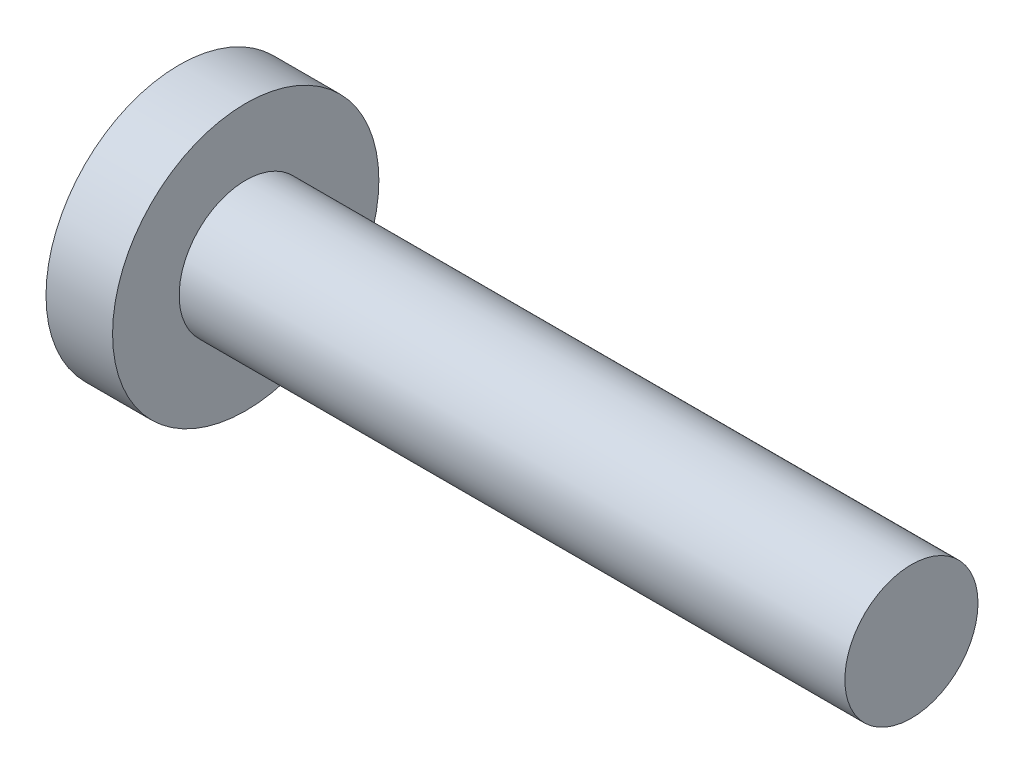
ISO-10303-21;
HEADER;
FILE_DESCRIPTION(('STEP AP214'),'2;1');
FILE_NAME('part.step','',(''),(''),'','','');
FILE_SCHEMA(('AUTOMOTIVE_DESIGN { 1 0 10303 214 1 1 1 1 }'));
ENDSEC;
DATA;
#1=APPLICATION_CONTEXT('core data for automotive mechanical design processes');
#2=APPLICATION_PROTOCOL_DEFINITION('international standard','automotive_design',2000,#1);
#3=PRODUCT_CONTEXT('',#1,'mechanical');
#4=PRODUCT('Part','Part','',(#3));
#5=PRODUCT_RELATED_PRODUCT_CATEGORY('part','',(#4));
#6=PRODUCT_DEFINITION_FORMATION('','',#4);
#7=PRODUCT_DEFINITION_CONTEXT('part definition',#1,'design');
#8=PRODUCT_DEFINITION('design','',#6,#7);
#9=PRODUCT_DEFINITION_SHAPE('','',#8);
#10=(LENGTH_UNIT() NAMED_UNIT(*) SI_UNIT(.MILLI.,.METRE.));
#11=(NAMED_UNIT(*) PLANE_ANGLE_UNIT() SI_UNIT($,.RADIAN.));
#12=(NAMED_UNIT(*) SI_UNIT($,.STERADIAN.) SOLID_ANGLE_UNIT());
#13=UNCERTAINTY_MEASURE_WITH_UNIT(LENGTH_MEASURE(1.E-05),#10,'distance_accuracy_value','');
#14=(GEOMETRIC_REPRESENTATION_CONTEXT(3) GLOBAL_UNCERTAINTY_ASSIGNED_CONTEXT((#13)) GLOBAL_UNIT_ASSIGNED_CONTEXT((#10,
#11,#12)) REPRESENTATION_CONTEXT('',''));
#15=CARTESIAN_POINT('',(0.,0.,0.));
#16=DIRECTION('',(0.,0.,1.));
#17=DIRECTION('',(1.,0.,0.));
#18=AXIS2_PLACEMENT_3D('',#15,#16,#17);
#19=CARTESIAN_POINT('',(25.4,0.,0.));
#20=DIRECTION('',(-1.,0.,0.));
#21=DIRECTION('',(0.,0.,1.));
#22=AXIS2_PLACEMENT_3D('',#19,#20,#21);
#23=CYLINDRICAL_SURFACE('',#22,2.54);
#24=CARTESIAN_POINT('',(25.4,0.,0.));
#25=DIRECTION('',(1.,0.,0.));
#26=DIRECTION('',(0.,0.,-1.));
#27=AXIS2_PLACEMENT_3D('',#24,#25,#26);
#28=CIRCLE('',#27,2.54);
#29=CARTESIAN_POINT('',(25.4,0.,-2.54));
#30=VERTEX_POINT('',#29);
#31=EDGE_CURVE('E10',#30,#30,#28,.T.);
#32=ORIENTED_EDGE('',*,*,#31,.F.);
#33=EDGE_LOOP('',(#32));
#34=FACE_BOUND('',#33,.T.);
#35=CARTESIAN_POINT('',(0.,0.,0.));
#36=DIRECTION('',(1.,0.,0.));
#37=DIRECTION('',(0.,0.,-1.));
#38=AXIS2_PLACEMENT_3D('',#35,#36,#37);
#39=CIRCLE('',#38,2.54);
#40=CARTESIAN_POINT('',(0.,0.,-2.54));
#41=VERTEX_POINT('',#40);
#42=EDGE_CURVE('E40',#41,#41,#39,.T.);
#43=ORIENTED_EDGE('',*,*,#42,.T.);
#44=EDGE_LOOP('',(#43));
#45=FACE_BOUND('',#44,.T.);
#46=ADVANCED_FACE('F37',(#34,#45),#23,.T.);
#47=CARTESIAN_POINT('',(25.4,0.,0.));
#48=DIRECTION('',(1.,0.,0.));
#49=DIRECTION('',(0.,0.,-1.));
#50=AXIS2_PLACEMENT_3D('',#47,#48,#49);
#51=PLANE('',#50);
#52=ORIENTED_EDGE('',*,*,#31,.T.);
#53=EDGE_LOOP('',(#52));
#54=FACE_BOUND('',#53,.T.);
#55=ADVANCED_FACE('F64',(#54),#51,.T.);
#56=CARTESIAN_POINT('',(-2.54,0.,0.));
#57=DIRECTION('',(1.,0.,0.));
#58=DIRECTION('',(0.,0.,-1.));
#59=AXIS2_PLACEMENT_3D('',#56,#57,#58);
#60=CYLINDRICAL_SURFACE('',#59,5.08);
#61=CARTESIAN_POINT('',(-2.54,0.,0.));
#62=DIRECTION('',(-1.,0.,0.));
#63=DIRECTION('',(0.,0.,1.));
#64=AXIS2_PLACEMENT_3D('',#61,#62,#63);
#65=CIRCLE('',#64,5.08);
#66=CARTESIAN_POINT('',(-2.54,0.,5.08));
#67=VERTEX_POINT('',#66);
#68=EDGE_CURVE('E49',#67,#67,#65,.T.);
#69=ORIENTED_EDGE('',*,*,#68,.F.);
#70=EDGE_LOOP('',(#69));
#71=FACE_BOUND('',#70,.T.);
#72=CARTESIAN_POINT('',(0.,0.,0.));
#73=DIRECTION('',(-1.,0.,0.));
#74=DIRECTION('',(0.,0.,1.));
#75=AXIS2_PLACEMENT_3D('',#72,#73,#74);
#76=CIRCLE('',#75,5.08);
#77=CARTESIAN_POINT('',(0.,0.,5.08));
#78=VERTEX_POINT('',#77);
#79=EDGE_CURVE('E51',#78,#78,#76,.T.);
#80=ORIENTED_EDGE('',*,*,#79,.T.);
#81=EDGE_LOOP('',(#80));
#82=FACE_BOUND('',#81,.T.);
#83=ADVANCED_FACE('F61',(#71,#82),#60,.T.);
#84=CARTESIAN_POINT('',(-2.54,0.,0.));
#85=DIRECTION('',(-1.,0.,0.));
#86=DIRECTION('',(0.,0.,1.));
#87=AXIS2_PLACEMENT_3D('',#84,#85,#86);
#88=PLANE('',#87);
#89=ORIENTED_EDGE('',*,*,#68,.T.);
#90=EDGE_LOOP('',(#89));
#91=FACE_BOUND('',#90,.T.);
#92=ADVANCED_FACE('F59',(#91),#88,.T.);
#93=CARTESIAN_POINT('',(0.,0.,0.));
#94=DIRECTION('',(-1.,0.,0.));
#95=DIRECTION('',(0.,0.,1.));
#96=AXIS2_PLACEMENT_3D('',#93,#94,#95);
#97=PLANE('',#96);
#98=ORIENTED_EDGE('',*,*,#42,.F.);
#99=EDGE_LOOP('',(#98));
#100=FACE_BOUND('',#99,.T.);
#101=ORIENTED_EDGE('',*,*,#79,.F.);
#102=EDGE_LOOP('',(#101));
#103=FACE_BOUND('',#102,.T.);
#104=ADVANCED_FACE('F68',(#100,#103),#97,.F.);
#105=CLOSED_SHELL('',(#46,#55,#83,#92,#104));
#106=MANIFOLD_SOLID_BREP('B2',#105);
#107=ADVANCED_BREP_SHAPE_REPRESENTATION('',(#18,#106),#14);
#108=SHAPE_DEFINITION_REPRESENTATION(#9,#107);
ENDSEC;
END-ISO-10303-21;
